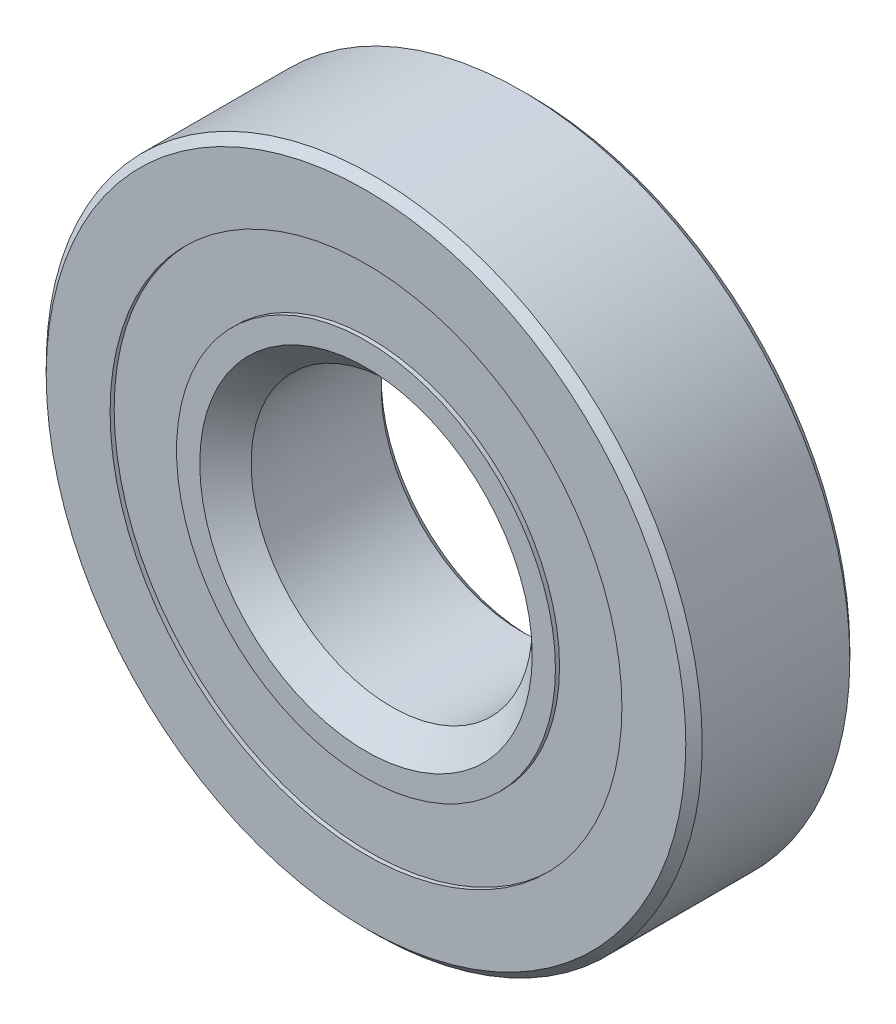
ISO-10303-21;
HEADER;
FILE_DESCRIPTION(('STEP AP214'),'2;1');
FILE_NAME('part.step','',(''),(''),'','','');
FILE_SCHEMA(('AUTOMOTIVE_DESIGN { 1 0 10303 214 1 1 1 1 }'));
ENDSEC;
DATA;
#1=APPLICATION_CONTEXT('core data for automotive mechanical design processes');
#2=APPLICATION_PROTOCOL_DEFINITION('international standard','automotive_design',2000,#1);
#3=PRODUCT_CONTEXT('',#1,'mechanical');
#4=PRODUCT('Part','Part','',(#3));
#5=PRODUCT_RELATED_PRODUCT_CATEGORY('part','',(#4));
#6=PRODUCT_DEFINITION_FORMATION('','',#4);
#7=PRODUCT_DEFINITION_CONTEXT('part definition',#1,'design');
#8=PRODUCT_DEFINITION('design','',#6,#7);
#9=PRODUCT_DEFINITION_SHAPE('','',#8);
#10=(LENGTH_UNIT() NAMED_UNIT(*) SI_UNIT(.MILLI.,.METRE.));
#11=(NAMED_UNIT(*) PLANE_ANGLE_UNIT() SI_UNIT($,.RADIAN.));
#12=(NAMED_UNIT(*) SI_UNIT($,.STERADIAN.) SOLID_ANGLE_UNIT());
#13=UNCERTAINTY_MEASURE_WITH_UNIT(LENGTH_MEASURE(1.E-05),#10,'distance_accuracy_value','');
#14=(GEOMETRIC_REPRESENTATION_CONTEXT(3) GLOBAL_UNCERTAINTY_ASSIGNED_CONTEXT((#13)) GLOBAL_UNIT_ASSIGNED_CONTEXT((#10,
#11,#12)) REPRESENTATION_CONTEXT('',''));
#15=CARTESIAN_POINT('',(0.,0.,0.));
#16=DIRECTION('',(0.,0.,1.));
#17=DIRECTION('',(1.,0.,0.));
#18=AXIS2_PLACEMENT_3D('',#15,#16,#17);
#19=CARTESIAN_POINT('',(0.,8.67019230769231,-2.63921875));
#20=DIRECTION('',(0.,0.,1.));
#21=DIRECTION('',(1.,0.,0.));
#22=AXIS2_PLACEMENT_3D('',#19,#20,#21);
#23=PLANE('',#22);
#24=CARTESIAN_POINT('',(0.,0.,-2.63921875));
#25=DIRECTION('',(0.,0.,1.));
#26=DIRECTION('',(1.,0.,0.));
#27=AXIS2_PLACEMENT_3D('',#24,#25,#26);
#28=CIRCLE('',#27,8.67019230769231);
#29=CARTESIAN_POINT('',(8.67019230769231,0.,-2.63921875));
#30=VERTEX_POINT('',#29);
#31=EDGE_CURVE('E58',#30,#30,#28,.T.);
#32=ORIENTED_EDGE('',*,*,#31,.F.);
#33=EDGE_LOOP('',(#32));
#34=FACE_BOUND('',#33,.T.);
#35=CARTESIAN_POINT('',(0.,0.,-2.63921875));
#36=DIRECTION('',(0.,0.,1.));
#37=DIRECTION('',(1.,0.,0.));
#38=AXIS2_PLACEMENT_3D('',#35,#36,#37);
#39=CIRCLE('',#38,6.41846644006812);
#40=CARTESIAN_POINT('',(6.41846644006812,0.,-2.63921875));
#41=VERTEX_POINT('',#40);
#42=EDGE_CURVE('E11',#41,#41,#39,.T.);
#43=ORIENTED_EDGE('',*,*,#42,.T.);
#44=EDGE_LOOP('',(#43));
#45=FACE_BOUND('',#44,.T.);
#46=ADVANCED_FACE('F44',(#34,#45),#23,.F.);
#47=CARTESIAN_POINT('',(0.,0.,2.778125));
#48=DIRECTION('',(0.,0.,1.));
#49=DIRECTION('',(1.,0.,0.));
#50=AXIS2_PLACEMENT_3D('',#47,#48,#49);
#51=CYLINDRICAL_SURFACE('',#50,6.41846644006811);
#52=ORIENTED_EDGE('',*,*,#42,.F.);
#53=EDGE_LOOP('',(#52));
#54=FACE_BOUND('',#53,.T.);
#55=CARTESIAN_POINT('',(0.,0.,-1.43574962434293));
#56=DIRECTION('',(0.,0.,1.));
#57=DIRECTION('',(1.,0.,0.));
#58=AXIS2_PLACEMENT_3D('',#55,#56,#57);
#59=CIRCLE('',#58,6.41846644006811);
#60=CARTESIAN_POINT('',(6.41846644006811,0.,-1.43574962434293));
#61=VERTEX_POINT('',#60);
#62=EDGE_CURVE('E50',#61,#61,#59,.T.);
#63=ORIENTED_EDGE('',*,*,#62,.T.);
#64=EDGE_LOOP('',(#63));
#65=FACE_BOUND('',#64,.T.);
#66=ADVANCED_FACE('F67',(#54,#65),#51,.F.);
#67=CARTESIAN_POINT('',(0.,8.67019230769231,-1.43574962434293));
#68=DIRECTION('',(0.,0.,-1.));
#69=DIRECTION('',(-1.,0.,0.));
#70=AXIS2_PLACEMENT_3D('',#67,#68,#69);
#71=PLANE('',#70);
#72=ORIENTED_EDGE('',*,*,#62,.F.);
#73=EDGE_LOOP('',(#72));
#74=FACE_BOUND('',#73,.T.);
#75=CARTESIAN_POINT('',(0.,0.,-1.43574962434293));
#76=DIRECTION('',(0.,0.,1.));
#77=DIRECTION('',(1.,0.,0.));
#78=AXIS2_PLACEMENT_3D('',#75,#76,#77);
#79=CIRCLE('',#78,8.67019230769231);
#80=CARTESIAN_POINT('',(8.67019230769231,0.,-1.43574962434293));
#81=VERTEX_POINT('',#80);
#82=EDGE_CURVE('E54',#81,#81,#79,.T.);
#83=ORIENTED_EDGE('',*,*,#82,.T.);
#84=EDGE_LOOP('',(#83));
#85=FACE_BOUND('',#84,.T.);
#86=ADVANCED_FACE('F71',(#74,#85),#71,.F.);
#87=CARTESIAN_POINT('',(0.,0.,2.778125));
#88=DIRECTION('',(0.,0.,1.));
#89=DIRECTION('',(1.,0.,0.));
#90=AXIS2_PLACEMENT_3D('',#87,#88,#89);
#91=CYLINDRICAL_SURFACE('',#90,8.67019230769231);
#92=ORIENTED_EDGE('',*,*,#82,.F.);
#93=EDGE_LOOP('',(#92));
#94=FACE_BOUND('',#93,.T.);
#95=ORIENTED_EDGE('',*,*,#31,.T.);
#96=EDGE_LOOP('',(#95));
#97=FACE_BOUND('',#96,.T.);
#98=ADVANCED_FACE('F64',(#94,#97),#91,.T.);
#99=CLOSED_SHELL('',(#46,#66,#86,#98));
#100=MANIFOLD_SOLID_BREP('B2',#99);
#101=CARTESIAN_POINT('',(0.,8.67019230769231,2.63921875));
#102=DIRECTION('',(0.,0.,-1.));
#103=DIRECTION('',(-1.,0.,0.));
#104=AXIS2_PLACEMENT_3D('',#101,#102,#103);
#105=PLANE('',#104);
#106=CARTESIAN_POINT('',(0.,0.,2.63921875));
#107=DIRECTION('',(0.,0.,1.));
#108=DIRECTION('',(1.,0.,0.));
#109=AXIS2_PLACEMENT_3D('',#106,#107,#108);
#110=CIRCLE('',#109,6.41846644006811);
#111=CARTESIAN_POINT('',(6.41846644006811,0.,2.63921875));
#112=VERTEX_POINT('',#111);
#113=EDGE_CURVE('E43',#112,#112,#110,.T.);
#114=ORIENTED_EDGE('',*,*,#113,.F.);
#115=EDGE_LOOP('',(#114));
#116=FACE_BOUND('',#115,.T.);
#117=CARTESIAN_POINT('',(0.,0.,2.63921875));
#118=DIRECTION('',(0.,0.,1.));
#119=DIRECTION('',(1.,0.,0.));
#120=AXIS2_PLACEMENT_3D('',#117,#118,#119);
#121=CIRCLE('',#120,8.67019230769231);
#122=CARTESIAN_POINT('',(8.67019230769231,0.,2.63921875));
#123=VERTEX_POINT('',#122);
#124=EDGE_CURVE('E126',#123,#123,#121,.T.);
#125=ORIENTED_EDGE('',*,*,#124,.T.);
#126=EDGE_LOOP('',(#125));
#127=FACE_BOUND('',#126,.T.);
#128=ADVANCED_FACE('F112',(#116,#127),#105,.F.);
#129=CARTESIAN_POINT('',(0.,0.,2.778125));
#130=DIRECTION('',(0.,0.,1.));
#131=DIRECTION('',(1.,0.,0.));
#132=AXIS2_PLACEMENT_3D('',#129,#130,#131);
#133=CYLINDRICAL_SURFACE('',#132,6.41846644006811);
#134=CARTESIAN_POINT('',(0.,0.,1.43574962434293));
#135=DIRECTION('',(0.,0.,1.));
#136=DIRECTION('',(1.,0.,0.));
#137=AXIS2_PLACEMENT_3D('',#134,#135,#136);
#138=CIRCLE('',#137,6.41846644006811);
#139=CARTESIAN_POINT('',(6.41846644006811,0.,1.43574962434293));
#140=VERTEX_POINT('',#139);
#141=EDGE_CURVE('E118',#140,#140,#138,.T.);
#142=ORIENTED_EDGE('',*,*,#141,.F.);
#143=EDGE_LOOP('',(#142));
#144=FACE_BOUND('',#143,.T.);
#145=ORIENTED_EDGE('',*,*,#113,.T.);
#146=EDGE_LOOP('',(#145));
#147=FACE_BOUND('',#146,.T.);
#148=ADVANCED_FACE('F141',(#144,#147),#133,.F.);
#149=CARTESIAN_POINT('',(0.,8.67019230769231,1.43574962434293));
#150=DIRECTION('',(0.,0.,1.));
#151=DIRECTION('',(1.,0.,0.));
#152=AXIS2_PLACEMENT_3D('',#149,#150,#151);
#153=PLANE('',#152);
#154=CARTESIAN_POINT('',(0.,0.,1.43574962434293));
#155=DIRECTION('',(0.,0.,1.));
#156=DIRECTION('',(1.,0.,0.));
#157=AXIS2_PLACEMENT_3D('',#154,#155,#156);
#158=CIRCLE('',#157,8.67019230769231);
#159=CARTESIAN_POINT('',(8.67019230769231,0.,1.43574962434293));
#160=VERTEX_POINT('',#159);
#161=EDGE_CURVE('E122',#160,#160,#158,.T.);
#162=ORIENTED_EDGE('',*,*,#161,.F.);
#163=EDGE_LOOP('',(#162));
#164=FACE_BOUND('',#163,.T.);
#165=ORIENTED_EDGE('',*,*,#141,.T.);
#166=EDGE_LOOP('',(#165));
#167=FACE_BOUND('',#166,.T.);
#168=ADVANCED_FACE('F136',(#164,#167),#153,.F.);
#169=CARTESIAN_POINT('',(0.,0.,2.778125));
#170=DIRECTION('',(0.,0.,1.));
#171=DIRECTION('',(1.,0.,0.));
#172=AXIS2_PLACEMENT_3D('',#169,#170,#171);
#173=CYLINDRICAL_SURFACE('',#172,8.67019230769231);
#174=ORIENTED_EDGE('',*,*,#124,.F.);
#175=EDGE_LOOP('',(#174));
#176=FACE_BOUND('',#175,.T.);
#177=ORIENTED_EDGE('',*,*,#161,.T.);
#178=EDGE_LOOP('',(#177));
#179=FACE_BOUND('',#178,.T.);
#180=ADVANCED_FACE('F133',(#176,#179),#173,.T.);
#181=CLOSED_SHELL('',(#128,#148,#168,#180));
#182=MANIFOLD_SOLID_BREP('B6',#181);
#183=CARTESIAN_POINT('',(-3.96874999999991,6.87407664253903,0.));
#184=DIRECTION('',(0.,0.,1.));
#185=DIRECTION('',(-0.499999999999989,0.866025403784445,0.));
#186=AXIS2_PLACEMENT_3D('',#183,#184,#185);
#187=SPHERICAL_SURFACE('',#186,1.43574962434293);
#188=CARTESIAN_POINT('',(-3.96874999999991,6.87407664253903,1.43574962434293));
#189=VERTEX_POINT('',#188);
#190=VERTEX_LOOP('',#189);
#191=FACE_BOUND('',#190,.T.);
#192=ADVANCED_FACE('F194',(#191),#187,.T.);
#193=CLOSED_SHELL('',(#192));
#194=MANIFOLD_SOLID_BREP('B38',#193);
#195=CARTESIAN_POINT('',(-6.87407664253894,3.96875000000008,0.));
#196=DIRECTION('',(0.,0.,1.));
#197=DIRECTION('',(-0.866025403784433,0.50000000000001,0.));
#198=AXIS2_PLACEMENT_3D('',#195,#196,#197);
#199=SPHERICAL_SURFACE('',#198,1.43574962434293);
#200=CARTESIAN_POINT('',(-6.87407664253894,3.96875000000008,1.43574962434293));
#201=VERTEX_POINT('',#200);
#202=VERTEX_LOOP('',#201);
#203=FACE_BOUND('',#202,.T.);
#204=ADVANCED_FACE('F227',(#203),#199,.T.);
#205=CLOSED_SHELL('',(#204));
#206=MANIFOLD_SOLID_BREP('B108',#205);
#207=CARTESIAN_POINT('',(-7.9375,0.,0.));
#208=DIRECTION('',(0.,0.,1.));
#209=DIRECTION('',(-1.,0.,0.));
#210=AXIS2_PLACEMENT_3D('',#207,#208,#209);
#211=SPHERICAL_SURFACE('',#210,1.43574962434293);
#212=CARTESIAN_POINT('',(-7.9375,0.,1.43574962434293));
#213=VERTEX_POINT('',#212);
#214=VERTEX_LOOP('',#213);
#215=FACE_BOUND('',#214,.T.);
#216=ADVANCED_FACE('F260',(#215),#211,.T.);
#217=CLOSED_SHELL('',(#216));
#218=MANIFOLD_SOLID_BREP('B190',#217);
#219=CARTESIAN_POINT('',(-6.87407664253902,-3.96874999999994,0.));
#220=DIRECTION('',(0.,0.,1.));
#221=DIRECTION('',(-0.866025403784443,-0.499999999999992,0.));
#222=AXIS2_PLACEMENT_3D('',#219,#220,#221);
#223=SPHERICAL_SURFACE('',#222,1.43574962434293);
#224=CARTESIAN_POINT('',(-6.87407664253902,-3.96874999999994,1.43574962434293));
#225=VERTEX_POINT('',#224);
#226=VERTEX_LOOP('',#225);
#227=FACE_BOUND('',#226,.T.);
#228=ADVANCED_FACE('F291',(#227),#223,.T.);
#229=CLOSED_SHELL('',(#228));
#230=MANIFOLD_SOLID_BREP('B223',#229);
#231=CARTESIAN_POINT('',(-3.96875000000006,-6.87407664253895,0.));
#232=DIRECTION('',(0.,0.,1.));
#233=DIRECTION('',(-0.500000000000007,-0.866025403784435,0.));
#234=AXIS2_PLACEMENT_3D('',#231,#232,#233);
#235=SPHERICAL_SURFACE('',#234,1.43574962434293);
#236=CARTESIAN_POINT('',(-3.96875000000006,-6.87407664253895,1.43574962434293));
#237=VERTEX_POINT('',#236);
#238=VERTEX_LOOP('',#237);
#239=FACE_BOUND('',#238,.T.);
#240=ADVANCED_FACE('F322',(#239),#235,.T.);
#241=CLOSED_SHELL('',(#240));
#242=MANIFOLD_SOLID_BREP('B256',#241);
#243=CARTESIAN_POINT('',(0.,-7.9375,0.));
#244=DIRECTION('',(0.,0.,1.));
#245=DIRECTION('',(0.,-1.,0.));
#246=AXIS2_PLACEMENT_3D('',#243,#244,#245);
#247=SPHERICAL_SURFACE('',#246,1.43574962434293);
#248=CARTESIAN_POINT('',(0.,-7.9375,1.43574962434293));
#249=VERTEX_POINT('',#248);
#250=VERTEX_LOOP('',#249);
#251=FACE_BOUND('',#250,.T.);
#252=ADVANCED_FACE('F355',(#251),#247,.T.);
#253=CLOSED_SHELL('',(#252));
#254=MANIFOLD_SOLID_BREP('B287',#253);
#255=CARTESIAN_POINT('',(3.96874999999996,-6.87407664253901,0.));
#256=DIRECTION('',(0.,0.,1.));
#257=DIRECTION('',(0.499999999999995,-0.866025403784442,0.));
#258=AXIS2_PLACEMENT_3D('',#255,#256,#257);
#259=SPHERICAL_SURFACE('',#258,1.43574962434293);
#260=CARTESIAN_POINT('',(3.96874999999996,-6.87407664253901,1.43574962434293));
#261=VERTEX_POINT('',#260);
#262=VERTEX_LOOP('',#261);
#263=FACE_BOUND('',#262,.T.);
#264=ADVANCED_FACE('F386',(#263),#259,.T.);
#265=CLOSED_SHELL('',(#264));
#266=MANIFOLD_SOLID_BREP('B318',#265);
#267=CARTESIAN_POINT('',(6.87407664253896,-3.96875000000003,0.));
#268=DIRECTION('',(0.,0.,1.));
#269=DIRECTION('',(0.866025403784436,-0.500000000000004,0.));
#270=AXIS2_PLACEMENT_3D('',#267,#268,#269);
#271=SPHERICAL_SURFACE('',#270,1.43574962434293);
#272=CARTESIAN_POINT('',(6.87407664253896,-3.96875000000003,1.43574962434293));
#273=VERTEX_POINT('',#272);
#274=VERTEX_LOOP('',#273);
#275=FACE_BOUND('',#274,.T.);
#276=ADVANCED_FACE('F419',(#275),#271,.T.);
#277=CLOSED_SHELL('',(#276));
#278=MANIFOLD_SOLID_BREP('B351',#277);
#279=CARTESIAN_POINT('',(7.9375,0.,0.));
#280=DIRECTION('',(0.,0.,1.));
#281=DIRECTION('',(1.,0.,0.));
#282=AXIS2_PLACEMENT_3D('',#279,#280,#281);
#283=SPHERICAL_SURFACE('',#282,1.43574962434293);
#284=CARTESIAN_POINT('',(7.9375,0.,1.43574962434293));
#285=VERTEX_POINT('',#284);
#286=VERTEX_LOOP('',#285);
#287=FACE_BOUND('',#286,.T.);
#288=ADVANCED_FACE('F452',(#287),#283,.T.);
#289=CLOSED_SHELL('',(#288));
#290=MANIFOLD_SOLID_BREP('B382',#289);
#291=CARTESIAN_POINT('',(6.87407664253899,3.96874999999998,0.));
#292=DIRECTION('',(0.,0.,1.));
#293=DIRECTION('',(0.86602540378444,0.499999999999998,0.));
#294=AXIS2_PLACEMENT_3D('',#291,#292,#293);
#295=SPHERICAL_SURFACE('',#294,1.43574962434293);
#296=CARTESIAN_POINT('',(6.87407664253899,3.96874999999998,1.43574962434293));
#297=VERTEX_POINT('',#296);
#298=VERTEX_LOOP('',#297);
#299=FACE_BOUND('',#298,.T.);
#300=ADVANCED_FACE('F483',(#299),#295,.T.);
#301=CLOSED_SHELL('',(#300));
#302=MANIFOLD_SOLID_BREP('B415',#301);
#303=CARTESIAN_POINT('',(3.96875000000001,6.87407664253898,0.));
#304=DIRECTION('',(0.,0.,1.));
#305=DIRECTION('',(0.500000000000001,0.866025403784438,0.));
#306=AXIS2_PLACEMENT_3D('',#303,#304,#305);
#307=SPHERICAL_SURFACE('',#306,1.43574962434293);
#308=CARTESIAN_POINT('',(3.96875000000001,6.87407664253898,1.43574962434293));
#309=VERTEX_POINT('',#308);
#310=VERTEX_LOOP('',#309);
#311=FACE_BOUND('',#310,.T.);
#312=ADVANCED_FACE('F514',(#311),#307,.T.);
#313=CLOSED_SHELL('',(#312));
#314=MANIFOLD_SOLID_BREP('B448',#313);
#315=CARTESIAN_POINT('',(0.,7.9375,0.));
#316=DIRECTION('',(0.,0.,1.));
#317=DIRECTION('',(0.,1.,0.));
#318=AXIS2_PLACEMENT_3D('',#315,#316,#317);
#319=SPHERICAL_SURFACE('',#318,1.43574962434293);
#320=CARTESIAN_POINT('',(0.,7.9375,1.43574962434293));
#321=VERTEX_POINT('',#320);
#322=VERTEX_LOOP('',#321);
#323=FACE_BOUND('',#322,.T.);
#324=ADVANCED_FACE('F549',(#323),#319,.T.);
#325=CLOSED_SHELL('',(#324));
#326=MANIFOLD_SOLID_BREP('B479',#325);
#327=CARTESIAN_POINT('',(0.,0.,2.778125));
#328=DIRECTION('',(0.,0.,1.));
#329=DIRECTION('',(1.,0.,0.));
#330=AXIS2_PLACEMENT_3D('',#327,#328,#329);
#331=CYLINDRICAL_SURFACE('',#330,6.41846644006811);
#332=CARTESIAN_POINT('',(0.,0.,2.778125));
#333=DIRECTION('',(0.,0.,1.));
#334=DIRECTION('',(1.,0.,0.));
#335=AXIS2_PLACEMENT_3D('',#332,#333,#334);
#336=CIRCLE('',#335,6.41846644006811);
#337=CARTESIAN_POINT('',(6.41846644006811,0.,2.778125));
#338=VERTEX_POINT('',#337);
#339=EDGE_CURVE('E609',#338,#338,#336,.T.);
#340=ORIENTED_EDGE('',*,*,#339,.F.);
#341=EDGE_LOOP('',(#340));
#342=FACE_BOUND('',#341,.T.);
#343=CARTESIAN_POINT('',(0.,0.,2.63921875));
#344=DIRECTION('',(0.,0.,1.));
#345=DIRECTION('',(1.,0.,0.));
#346=AXIS2_PLACEMENT_3D('',#343,#344,#345);
#347=CIRCLE('',#346,6.41846644006811);
#348=CARTESIAN_POINT('',(6.41846644006811,0.,2.63921875));
#349=VERTEX_POINT('',#348);
#350=EDGE_CURVE('E548',#349,#349,#347,.T.);
#351=ORIENTED_EDGE('',*,*,#350,.T.);
#352=EDGE_LOOP('',(#351));
#353=FACE_BOUND('',#352,.T.);
#354=ADVANCED_FACE('F569',(#342,#353),#331,.T.);
#355=CARTESIAN_POINT('',(0.,6.41846644006811,2.63921875));
#356=DIRECTION('',(0.,0.,1.));
#357=DIRECTION('',(1.,0.,0.));
#358=AXIS2_PLACEMENT_3D('',#355,#356,#357);
#359=PLANE('',#358);
#360=ORIENTED_EDGE('',*,*,#350,.F.);
#361=EDGE_LOOP('',(#360));
#362=FACE_BOUND('',#361,.T.);
#363=CARTESIAN_POINT('',(0.,0.,2.63921875));
#364=DIRECTION('',(0.,0.,1.));
#365=DIRECTION('',(1.,0.,0.));
#366=AXIS2_PLACEMENT_3D('',#363,#364,#365);
#367=CIRCLE('',#366,6.27956019006811);
#368=CARTESIAN_POINT('',(6.27956019006811,0.,2.63921875));
#369=VERTEX_POINT('',#368);
#370=EDGE_CURVE('E575',#369,#369,#367,.T.);
#371=ORIENTED_EDGE('',*,*,#370,.T.);
#372=EDGE_LOOP('',(#371));
#373=FACE_BOUND('',#372,.T.);
#374=ADVANCED_FACE('F616',(#362,#373),#359,.F.);
#375=CARTESIAN_POINT('',(0.,0.,1.99178374776042));
#376=DIRECTION('',(0.,0.,1.));
#377=DIRECTION('',(1.,0.,0.));
#378=AXIS2_PLACEMENT_3D('',#375,#376,#377);
#379=CONICAL_SURFACE('',#378,5.63212518782854,0.78539816339745);
#380=ORIENTED_EDGE('',*,*,#370,.F.);
#381=EDGE_LOOP('',(#380));
#382=FACE_BOUND('',#381,.T.);
#383=CARTESIAN_POINT('',(0.,0.,1.99178374776042));
#384=DIRECTION('',(0.,0.,1.));
#385=DIRECTION('',(1.,0.,0.));
#386=AXIS2_PLACEMENT_3D('',#383,#384,#385);
#387=CIRCLE('',#386,5.63212518782854);
#388=CARTESIAN_POINT('',(5.63212518782854,0.,1.99178374776042));
#389=VERTEX_POINT('',#388);
#390=EDGE_CURVE('E579',#389,#389,#387,.T.);
#391=ORIENTED_EDGE('',*,*,#390,.T.);
#392=EDGE_LOOP('',(#391));
#393=FACE_BOUND('',#392,.T.);
#394=ADVANCED_FACE('F620',(#382,#393),#379,.T.);
#395=CARTESIAN_POINT('',(0.,0.,2.778125));
#396=DIRECTION('',(0.,0.,1.));
#397=DIRECTION('',(1.,0.,0.));
#398=AXIS2_PLACEMENT_3D('',#395,#396,#397);
#399=CYLINDRICAL_SURFACE('',#398,5.63212518782854);
#400=ORIENTED_EDGE('',*,*,#390,.F.);
#401=EDGE_LOOP('',(#400));
#402=FACE_BOUND('',#401,.T.);
#403=CARTESIAN_POINT('',(0.,0.,0.));
#404=DIRECTION('',(0.,0.,1.));
#405=DIRECTION('',(1.,0.,0.));
#406=AXIS2_PLACEMENT_3D('',#403,#404,#405);
#407=CIRCLE('',#406,5.63212518782854);
#408=CARTESIAN_POINT('',(5.63212518782854,0.,0.));
#409=VERTEX_POINT('',#408);
#410=EDGE_CURVE('E583',#409,#409,#407,.T.);
#411=ORIENTED_EDGE('',*,*,#410,.T.);
#412=EDGE_LOOP('',(#411));
#413=FACE_BOUND('',#412,.T.);
#414=ADVANCED_FACE('F625',(#402,#413),#399,.T.);
#415=CARTESIAN_POINT('',(0.,5.63212518782854,0.));
#416=DIRECTION('',(0.,0.,-1.));
#417=DIRECTION('',(-1.,0.,0.));
#418=AXIS2_PLACEMENT_3D('',#415,#416,#417);
#419=PLANE('',#418);
#420=ORIENTED_EDGE('',*,*,#410,.F.);
#421=EDGE_LOOP('',(#420));
#422=FACE_BOUND('',#421,.T.);
#423=CARTESIAN_POINT('',(0.,0.,0.));
#424=DIRECTION('',(0.,0.,1.));
#425=DIRECTION('',(1.,0.,0.));
#426=AXIS2_PLACEMENT_3D('',#423,#424,#425);
#427=CIRCLE('',#426,6.50175037565707);
#428=CARTESIAN_POINT('',(6.50175037565707,0.,0.));
#429=VERTEX_POINT('',#428);
#430=EDGE_CURVE('E588',#429,#429,#427,.T.);
#431=ORIENTED_EDGE('',*,*,#430,.T.);
#432=EDGE_LOOP('',(#431));
#433=FACE_BOUND('',#432,.T.);
#434=ADVANCED_FACE('F631',(#422,#433),#419,.F.);
#435=CARTESIAN_POINT('',(0.,0.,0.));
#436=DIRECTION('',(0.,0.,1.));
#437=DIRECTION('',(1.,0.,0.));
#438=AXIS2_PLACEMENT_3D('',#435,#436,#437);
#439=TOROIDAL_SURFACE('',#438,7.9375,1.43574962434293);
#440=ORIENTED_EDGE('',*,*,#430,.F.);
#441=EDGE_LOOP('',(#440));
#442=FACE_BOUND('',#441,.T.);
#443=CARTESIAN_POINT('',(0.,0.,-1.23472222222222));
#444=DIRECTION('',(0.,0.,1.));
#445=DIRECTION('',(1.,0.,0.));
#446=AXIS2_PLACEMENT_3D('',#443,#444,#445);
#447=CIRCLE('',#446,7.20480769230769);
#448=CARTESIAN_POINT('',(7.20480769230769,0.,-1.23472222222222));
#449=VERTEX_POINT('',#448);
#450=EDGE_CURVE('E591',#449,#449,#447,.T.);
#451=ORIENTED_EDGE('',*,*,#450,.T.);
#452=EDGE_LOOP('',(#451));
#453=FACE_BOUND('',#452,.T.);
#454=ADVANCED_FACE('F635',(#442,#453),#439,.F.);
#455=CARTESIAN_POINT('',(0.,0.,2.778125));
#456=DIRECTION('',(0.,0.,1.));
#457=DIRECTION('',(1.,0.,0.));
#458=AXIS2_PLACEMENT_3D('',#455,#456,#457);
#459=CYLINDRICAL_SURFACE('',#458,7.20480769230769);
#460=ORIENTED_EDGE('',*,*,#450,.F.);
#461=EDGE_LOOP('',(#460));
#462=FACE_BOUND('',#461,.T.);
#463=CARTESIAN_POINT('',(0.,0.,-2.778125));
#464=DIRECTION('',(0.,0.,1.));
#465=DIRECTION('',(1.,0.,0.));
#466=AXIS2_PLACEMENT_3D('',#463,#464,#465);
#467=CIRCLE('',#466,7.20480769230769);
#468=CARTESIAN_POINT('',(7.20480769230769,0.,-2.778125));
#469=VERTEX_POINT('',#468);
#470=EDGE_CURVE('E594',#469,#469,#467,.T.);
#471=ORIENTED_EDGE('',*,*,#470,.T.);
#472=EDGE_LOOP('',(#471));
#473=FACE_BOUND('',#472,.T.);
#474=ADVANCED_FACE('F639',(#462,#473),#459,.T.);
#475=CARTESIAN_POINT('',(0.,5.0403125,-2.778125));
#476=DIRECTION('',(0.,0.,1.));
#477=DIRECTION('',(1.,0.,0.));
#478=AXIS2_PLACEMENT_3D('',#475,#476,#477);
#479=PLANE('',#478);
#480=ORIENTED_EDGE('',*,*,#470,.F.);
#481=EDGE_LOOP('',(#480));
#482=FACE_BOUND('',#481,.T.);
#483=CARTESIAN_POINT('',(0.,0.,-2.778125));
#484=DIRECTION('',(0.,0.,1.));
#485=DIRECTION('',(1.,0.,0.));
#486=AXIS2_PLACEMENT_3D('',#483,#484,#485);
#487=CIRCLE('',#486,5.0403125);
#488=CARTESIAN_POINT('',(5.0403125,0.,-2.778125));
#489=VERTEX_POINT('',#488);
#490=EDGE_CURVE('E597',#489,#489,#487,.T.);
#491=ORIENTED_EDGE('',*,*,#490,.T.);
#492=EDGE_LOOP('',(#491));
#493=FACE_BOUND('',#492,.T.);
#494=ADVANCED_FACE('F643',(#482,#493),#479,.F.);
#495=CARTESIAN_POINT('',(0.,0.,-2.5003125));
#496=DIRECTION('',(0.,0.,-1.));
#497=DIRECTION('',(-1.,0.,0.));
#498=AXIS2_PLACEMENT_3D('',#495,#496,#497);
#499=CONICAL_SURFACE('',#498,4.7625,0.785398163397445);
#500=ORIENTED_EDGE('',*,*,#490,.F.);
#501=EDGE_LOOP('',(#500));
#502=FACE_BOUND('',#501,.T.);
#503=CARTESIAN_POINT('',(0.,0.,-2.5003125));
#504=DIRECTION('',(0.,0.,1.));
#505=DIRECTION('',(1.,0.,0.));
#506=AXIS2_PLACEMENT_3D('',#503,#504,#505);
#507=CIRCLE('',#506,4.7625);
#508=CARTESIAN_POINT('',(4.7625,0.,-2.5003125));
#509=VERTEX_POINT('',#508);
#510=EDGE_CURVE('E600',#509,#509,#507,.T.);
#511=ORIENTED_EDGE('',*,*,#510,.T.);
#512=EDGE_LOOP('',(#511));
#513=FACE_BOUND('',#512,.T.);
#514=ADVANCED_FACE('F647',(#502,#513),#499,.F.);
#515=CARTESIAN_POINT('',(0.,0.,2.778125));
#516=DIRECTION('',(0.,0.,1.));
#517=DIRECTION('',(1.,0.,0.));
#518=AXIS2_PLACEMENT_3D('',#515,#516,#517);
#519=CYLINDRICAL_SURFACE('',#518,4.7625);
#520=ORIENTED_EDGE('',*,*,#510,.F.);
#521=EDGE_LOOP('',(#520));
#522=FACE_BOUND('',#521,.T.);
#523=CARTESIAN_POINT('',(0.,0.,1.90849981217147));
#524=DIRECTION('',(0.,0.,1.));
#525=DIRECTION('',(1.,0.,0.));
#526=AXIS2_PLACEMENT_3D('',#523,#524,#525);
#527=CIRCLE('',#526,4.7625);
#528=CARTESIAN_POINT('',(4.7625,0.,1.90849981217147));
#529=VERTEX_POINT('',#528);
#530=EDGE_CURVE('E603',#529,#529,#527,.T.);
#531=ORIENTED_EDGE('',*,*,#530,.T.);
#532=EDGE_LOOP('',(#531));
#533=FACE_BOUND('',#532,.T.);
#534=ADVANCED_FACE('F651',(#522,#533),#519,.F.);
#535=CARTESIAN_POINT('',(0.,0.,2.778125));
#536=DIRECTION('',(0.,0.,1.));
#537=DIRECTION('',(1.,0.,0.));
#538=AXIS2_PLACEMENT_3D('',#535,#536,#537);
#539=CONICAL_SURFACE('',#538,5.63212518782854,0.78539816339745);
#540=ORIENTED_EDGE('',*,*,#530,.F.);
#541=EDGE_LOOP('',(#540));
#542=FACE_BOUND('',#541,.T.);
#543=CARTESIAN_POINT('',(0.,0.,2.778125));
#544=DIRECTION('',(0.,0.,1.));
#545=DIRECTION('',(1.,0.,0.));
#546=AXIS2_PLACEMENT_3D('',#543,#544,#545);
#547=CIRCLE('',#546,5.63212518782854);
#548=CARTESIAN_POINT('',(5.63212518782854,0.,2.778125));
#549=VERTEX_POINT('',#548);
#550=EDGE_CURVE('E606',#549,#549,#547,.T.);
#551=ORIENTED_EDGE('',*,*,#550,.T.);
#552=EDGE_LOOP('',(#551));
#553=FACE_BOUND('',#552,.T.);
#554=ADVANCED_FACE('F655',(#542,#553),#539,.F.);
#555=CARTESIAN_POINT('',(0.,6.41846644006811,2.778125));
#556=DIRECTION('',(0.,0.,-1.));
#557=DIRECTION('',(-1.,0.,0.));
#558=AXIS2_PLACEMENT_3D('',#555,#556,#557);
#559=PLANE('',#558);
#560=ORIENTED_EDGE('',*,*,#550,.F.);
#561=EDGE_LOOP('',(#560));
#562=FACE_BOUND('',#561,.T.);
#563=ORIENTED_EDGE('',*,*,#339,.T.);
#564=EDGE_LOOP('',(#563));
#565=FACE_BOUND('',#564,.T.);
#566=ADVANCED_FACE('F613',(#562,#565),#559,.F.);
#567=CLOSED_SHELL('',(#354,#374,#394,#414,#434,#454,#474,#494,#514,#534,#554,#566));
#568=MANIFOLD_SOLID_BREP('B510',#567);
#569=CARTESIAN_POINT('',(0.,0.,2.5003125));
#570=DIRECTION('',(0.,0.,-1.));
#571=DIRECTION('',(-1.,0.,0.));
#572=AXIS2_PLACEMENT_3D('',#569,#570,#571);
#573=CONICAL_SURFACE('',#572,11.1125,0.785398163397446);
#574=CARTESIAN_POINT('',(0.,0.,2.778125));
#575=DIRECTION('',(0.,0.,1.));
#576=DIRECTION('',(1.,0.,0.));
#577=AXIS2_PLACEMENT_3D('',#574,#575,#576);
#578=CIRCLE('',#577,10.8346875);
#579=CARTESIAN_POINT('',(10.8346875,0.,2.778125));
#580=VERTEX_POINT('',#579);
#581=EDGE_CURVE('E779',#580,#580,#578,.T.);
#582=ORIENTED_EDGE('',*,*,#581,.F.);
#583=EDGE_LOOP('',(#582));
#584=FACE_BOUND('',#583,.T.);
#585=CARTESIAN_POINT('',(0.,0.,2.5003125));
#586=DIRECTION('',(0.,0.,1.));
#587=DIRECTION('',(1.,0.,0.));
#588=AXIS2_PLACEMENT_3D('',#585,#586,#587);
#589=CIRCLE('',#588,11.1125);
#590=CARTESIAN_POINT('',(11.1125,0.,2.5003125));
#591=VERTEX_POINT('',#590);
#592=EDGE_CURVE('E568',#591,#591,#589,.T.);
#593=ORIENTED_EDGE('',*,*,#592,.T.);
#594=EDGE_LOOP('',(#593));
#595=FACE_BOUND('',#594,.T.);
#596=ADVANCED_FACE('F751',(#584,#595),#573,.T.);
#597=CARTESIAN_POINT('',(0.,0.,2.778125));
#598=DIRECTION('',(0.,0.,1.));
#599=DIRECTION('',(1.,0.,0.));
#600=AXIS2_PLACEMENT_3D('',#597,#598,#599);
#601=CYLINDRICAL_SURFACE('',#600,11.1125);
#602=ORIENTED_EDGE('',*,*,#592,.F.);
#603=EDGE_LOOP('',(#602));
#604=FACE_BOUND('',#603,.T.);
#605=CARTESIAN_POINT('',(0.,0.,-2.5003125));
#606=DIRECTION('',(0.,0.,1.));
#607=DIRECTION('',(1.,0.,0.));
#608=AXIS2_PLACEMENT_3D('',#605,#606,#607);
#609=CIRCLE('',#608,11.1125);
#610=CARTESIAN_POINT('',(11.1125,0.,-2.5003125));
#611=VERTEX_POINT('',#610);
#612=EDGE_CURVE('E757',#611,#611,#609,.T.);
#613=ORIENTED_EDGE('',*,*,#612,.T.);
#614=EDGE_LOOP('',(#613));
#615=FACE_BOUND('',#614,.T.);
#616=ADVANCED_FACE('F786',(#604,#615),#601,.T.);
#617=CARTESIAN_POINT('',(0.,0.,-2.778125));
#618=DIRECTION('',(0.,0.,1.));
#619=DIRECTION('',(1.,0.,0.));
#620=AXIS2_PLACEMENT_3D('',#617,#618,#619);
#621=CONICAL_SURFACE('',#620,10.8346875,0.785398163397445);
#622=ORIENTED_EDGE('',*,*,#612,.F.);
#623=EDGE_LOOP('',(#622));
#624=FACE_BOUND('',#623,.T.);
#625=CARTESIAN_POINT('',(0.,0.,-2.778125));
#626=DIRECTION('',(0.,0.,1.));
#627=DIRECTION('',(1.,0.,0.));
#628=AXIS2_PLACEMENT_3D('',#625,#626,#627);
#629=CIRCLE('',#628,10.8346875);
#630=CARTESIAN_POINT('',(10.8346875,0.,-2.778125));
#631=VERTEX_POINT('',#630);
#632=EDGE_CURVE('E761',#631,#631,#629,.T.);
#633=ORIENTED_EDGE('',*,*,#632,.T.);
#634=EDGE_LOOP('',(#633));
#635=FACE_BOUND('',#634,.T.);
#636=ADVANCED_FACE('F790',(#624,#635),#621,.T.);
#637=CARTESIAN_POINT('',(0.,10.8346875,-2.778125));
#638=DIRECTION('',(0.,0.,1.));
#639=DIRECTION('',(1.,0.,0.));
#640=AXIS2_PLACEMENT_3D('',#637,#638,#639);
#641=PLANE('',#640);
#642=ORIENTED_EDGE('',*,*,#632,.F.);
#643=EDGE_LOOP('',(#642));
#644=FACE_BOUND('',#643,.T.);
#645=CARTESIAN_POINT('',(0.,0.,-2.778125));
#646=DIRECTION('',(0.,0.,1.));
#647=DIRECTION('',(1.,0.,0.));
#648=AXIS2_PLACEMENT_3D('',#645,#646,#647);
#649=CIRCLE('',#648,8.67019230769231);
#650=CARTESIAN_POINT('',(8.67019230769231,0.,-2.778125));
#651=VERTEX_POINT('',#650);
#652=EDGE_CURVE('E765',#651,#651,#649,.T.);
#653=ORIENTED_EDGE('',*,*,#652,.T.);
#654=EDGE_LOOP('',(#653));
#655=FACE_BOUND('',#654,.T.);
#656=ADVANCED_FACE('F795',(#644,#655),#641,.F.);
#657=CARTESIAN_POINT('',(0.,0.,2.778125));
#658=DIRECTION('',(0.,0.,1.));
#659=DIRECTION('',(1.,0.,0.));
#660=AXIS2_PLACEMENT_3D('',#657,#658,#659);
#661=CYLINDRICAL_SURFACE('',#660,8.67019230769231);
#662=ORIENTED_EDGE('',*,*,#652,.F.);
#663=EDGE_LOOP('',(#662));
#664=FACE_BOUND('',#663,.T.);
#665=CARTESIAN_POINT('',(0.,0.,-1.23472222222222));
#666=DIRECTION('',(0.,0.,1.));
#667=DIRECTION('',(1.,0.,0.));
#668=AXIS2_PLACEMENT_3D('',#665,#666,#667);
#669=CIRCLE('',#668,8.67019230769231);
#670=CARTESIAN_POINT('',(8.67019230769231,0.,-1.23472222222222));
#671=VERTEX_POINT('',#670);
#672=EDGE_CURVE('E770',#671,#671,#669,.T.);
#673=ORIENTED_EDGE('',*,*,#672,.T.);
#674=EDGE_LOOP('',(#673));
#675=FACE_BOUND('',#674,.T.);
#676=ADVANCED_FACE('F801',(#664,#675),#661,.F.);
#677=CARTESIAN_POINT('',(0.,0.,0.));
#678=DIRECTION('',(0.,0.,1.));
#679=DIRECTION('',(1.,0.,0.));
#680=AXIS2_PLACEMENT_3D('',#677,#678,#679);
#681=TOROIDAL_SURFACE('',#680,7.9375,1.43574962434293);
#682=ORIENTED_EDGE('',*,*,#672,.F.);
#683=EDGE_LOOP('',(#682));
#684=FACE_BOUND('',#683,.T.);
#685=CARTESIAN_POINT('',(0.,0.,1.23472222222222));
#686=DIRECTION('',(0.,0.,1.));
#687=DIRECTION('',(1.,0.,0.));
#688=AXIS2_PLACEMENT_3D('',#685,#686,#687);
#689=CIRCLE('',#688,8.67019230769231);
#690=CARTESIAN_POINT('',(8.67019230769231,0.,1.23472222222222));
#691=VERTEX_POINT('',#690);
#692=EDGE_CURVE('E773',#691,#691,#689,.T.);
#693=ORIENTED_EDGE('',*,*,#692,.T.);
#694=EDGE_LOOP('',(#693));
#695=FACE_BOUND('',#694,.T.);
#696=ADVANCED_FACE('F805',(#684,#695),#681,.F.);
#697=CARTESIAN_POINT('',(0.,0.,2.778125));
#698=DIRECTION('',(0.,0.,1.));
#699=DIRECTION('',(1.,0.,0.));
#700=AXIS2_PLACEMENT_3D('',#697,#698,#699);
#701=CYLINDRICAL_SURFACE('',#700,8.67019230769231);
#702=ORIENTED_EDGE('',*,*,#692,.F.);
#703=EDGE_LOOP('',(#702));
#704=FACE_BOUND('',#703,.T.);
#705=CARTESIAN_POINT('',(0.,0.,2.778125));
#706=DIRECTION('',(0.,0.,1.));
#707=DIRECTION('',(1.,0.,0.));
#708=AXIS2_PLACEMENT_3D('',#705,#706,#707);
#709=CIRCLE('',#708,8.67019230769231);
#710=CARTESIAN_POINT('',(8.67019230769231,0.,2.778125));
#711=VERTEX_POINT('',#710);
#712=EDGE_CURVE('E776',#711,#711,#709,.T.);
#713=ORIENTED_EDGE('',*,*,#712,.T.);
#714=EDGE_LOOP('',(#713));
#715=FACE_BOUND('',#714,.T.);
#716=ADVANCED_FACE('F809',(#704,#715),#701,.F.);
#717=CARTESIAN_POINT('',(0.,10.8346875,2.778125));
#718=DIRECTION('',(0.,0.,-1.));
#719=DIRECTION('',(-1.,0.,0.));
#720=AXIS2_PLACEMENT_3D('',#717,#718,#719);
#721=PLANE('',#720);
#722=ORIENTED_EDGE('',*,*,#712,.F.);
#723=EDGE_LOOP('',(#722));
#724=FACE_BOUND('',#723,.T.);
#725=ORIENTED_EDGE('',*,*,#581,.T.);
#726=EDGE_LOOP('',(#725));
#727=FACE_BOUND('',#726,.T.);
#728=ADVANCED_FACE('F783',(#724,#727),#721,.F.);
#729=CLOSED_SHELL('',(#596,#616,#636,#656,#676,#696,#716,#728));
#730=MANIFOLD_SOLID_BREP('B543',#729);
#731=ADVANCED_BREP_SHAPE_REPRESENTATION('',(#18,#100,#182,#194,#206,#218,#230,#242,#254,#266,
#278,#290,#302,#314,#326,#568,#730),#14);
#732=SHAPE_DEFINITION_REPRESENTATION(#9,#731);
ENDSEC;
END-ISO-10303-21;
